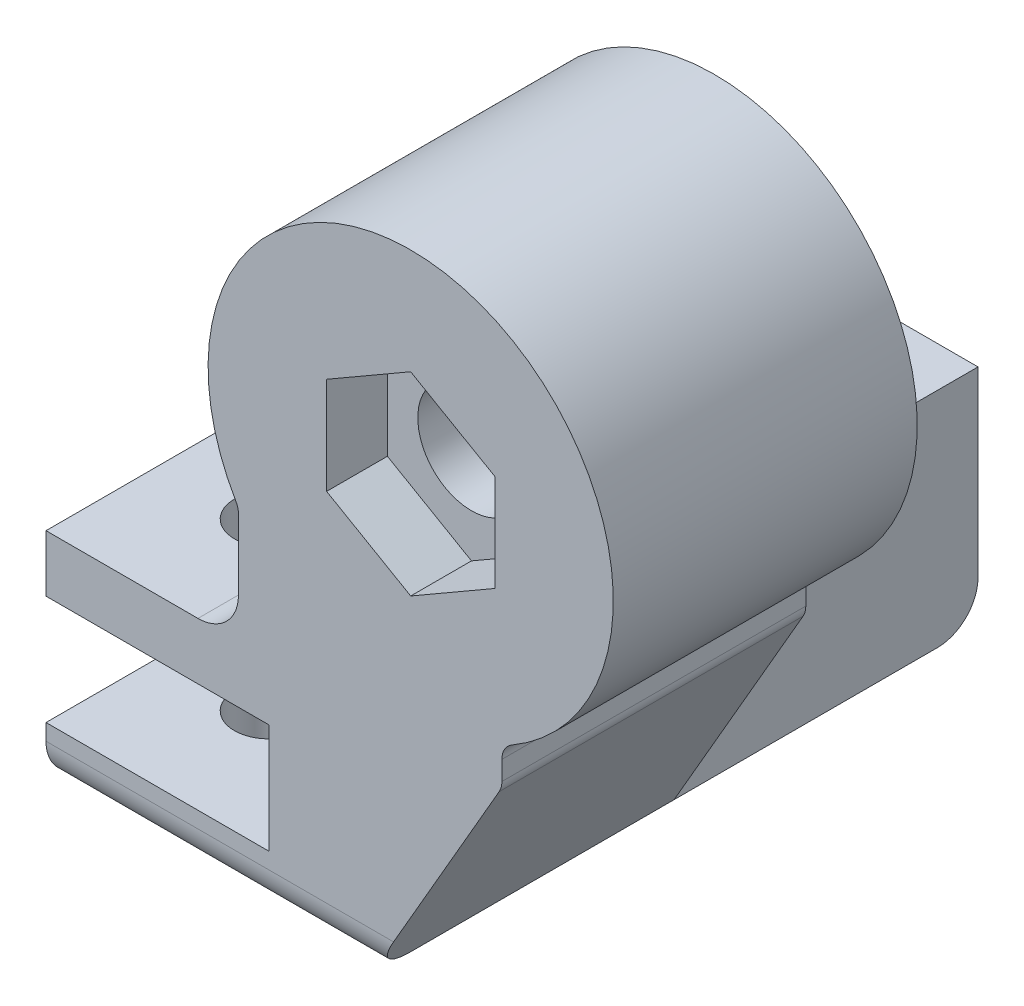
ISO-10303-21;
HEADER;
FILE_DESCRIPTION(('STEP AP214'),'2;1');
FILE_NAME('part.step','',(''),(''),'','','');
FILE_SCHEMA(('AUTOMOTIVE_DESIGN { 1 0 10303 214 1 1 1 1 }'));
ENDSEC;
DATA;
#1=APPLICATION_CONTEXT('core data for automotive mechanical design processes');
#2=APPLICATION_PROTOCOL_DEFINITION('international standard','automotive_design',2000,#1);
#3=PRODUCT_CONTEXT('',#1,'mechanical');
#4=PRODUCT('Part','Part','',(#3));
#5=PRODUCT_RELATED_PRODUCT_CATEGORY('part','',(#4));
#6=PRODUCT_DEFINITION_FORMATION('','',#4);
#7=PRODUCT_DEFINITION_CONTEXT('part definition',#1,'design');
#8=PRODUCT_DEFINITION('design','',#6,#7);
#9=PRODUCT_DEFINITION_SHAPE('','',#8);
#10=(LENGTH_UNIT() NAMED_UNIT(*) SI_UNIT(.MILLI.,.METRE.));
#11=(NAMED_UNIT(*) PLANE_ANGLE_UNIT() SI_UNIT($,.RADIAN.));
#12=(NAMED_UNIT(*) SI_UNIT($,.STERADIAN.) SOLID_ANGLE_UNIT());
#13=UNCERTAINTY_MEASURE_WITH_UNIT(LENGTH_MEASURE(1.E-05),#10,'distance_accuracy_value','');
#14=(GEOMETRIC_REPRESENTATION_CONTEXT(3) GLOBAL_UNCERTAINTY_ASSIGNED_CONTEXT((#13)) GLOBAL_UNIT_ASSIGNED_CONTEXT((#10,
#11,#12)) REPRESENTATION_CONTEXT('',''));
#15=CARTESIAN_POINT('',(0.,0.,0.));
#16=DIRECTION('',(0.,0.,1.));
#17=DIRECTION('',(1.,0.,0.));
#18=AXIS2_PLACEMENT_3D('',#15,#16,#17);
#19=CARTESIAN_POINT('',(18.,22.,-15.));
#20=DIRECTION('',(0.,0.,1.));
#21=DIRECTION('',(1.,0.,0.));
#22=AXIS2_PLACEMENT_3D('',#19,#20,#21);
#23=CYLINDRICAL_SURFACE('',#22,2.65);
#24=CARTESIAN_POINT('',(18.,22.,-10.));
#25=DIRECTION('',(0.,0.,-1.));
#26=DIRECTION('',(-1.,0.,0.));
#27=AXIS2_PLACEMENT_3D('',#24,#25,#26);
#28=CIRCLE('',#27,2.65);
#29=CARTESIAN_POINT('',(15.35,22.,-10.));
#30=VERTEX_POINT('',#29);
#31=EDGE_CURVE('E265',#30,#30,#28,.F.);
#32=ORIENTED_EDGE('',*,*,#31,.F.);
#33=EDGE_LOOP('',(#32));
#34=FACE_BOUND('',#33,.T.);
#35=CARTESIAN_POINT('',(18.,22.,-3.));
#36=DIRECTION('',(0.,0.,1.));
#37=DIRECTION('',(1.,0.,0.));
#38=AXIS2_PLACEMENT_3D('',#35,#36,#37);
#39=CIRCLE('',#38,2.65);
#40=CARTESIAN_POINT('',(20.65,22.,-3.));
#41=VERTEX_POINT('',#40);
#42=EDGE_CURVE('E254',#41,#41,#39,.F.);
#43=ORIENTED_EDGE('',*,*,#42,.F.);
#44=EDGE_LOOP('',(#43));
#45=FACE_BOUND('',#44,.T.);
#46=ADVANCED_FACE('F37',(#34,#45),#23,.F.);
#47=CARTESIAN_POINT('',(16.,11.,-30.));
#48=DIRECTION('',(1.,0.,0.));
#49=DIRECTION('',(0.,1.,0.));
#50=AXIS2_PLACEMENT_3D('',#47,#48,#49);
#51=PLANE('',#50);
#52=DIRECTION('',(0.,0.,1.));
#53=VECTOR('',#52,1.);
#54=CARTESIAN_POINT('',(16.,0.,-30.));
#55=LINE('',#54,#53);
#56=CARTESIAN_POINT('',(16.,0.,-28.));
#57=VERTEX_POINT('',#56);
#58=CARTESIAN_POINT('',(16.,0.,-15.));
#59=VERTEX_POINT('',#58);
#60=EDGE_CURVE('E318',#57,#59,#55,.T.);
#61=ORIENTED_EDGE('',*,*,#60,.F.);
#62=CARTESIAN_POINT('',(16.,2.,-28.));
#63=DIRECTION('',(1.,0.,0.));
#64=DIRECTION('',(0.,1.,0.));
#65=AXIS2_PLACEMENT_3D('',#62,#63,#64);
#66=CIRCLE('',#65,2.);
#67=CARTESIAN_POINT('',(16.,2.00000000000001,-30.));
#68=VERTEX_POINT('',#67);
#69=EDGE_CURVE('E45',#57,#68,#66,.T.);
#70=ORIENTED_EDGE('',*,*,#69,.T.);
#71=DIRECTION('',(0.,1.,0.));
#72=VECTOR('',#71,1.);
#73=CARTESIAN_POINT('',(16.,11.,-30.));
#74=LINE('',#73,#72);
#75=CARTESIAN_POINT('',(16.,11.,-30.));
#76=VERTEX_POINT('',#75);
#77=EDGE_CURVE('E298',#68,#76,#74,.T.);
#78=ORIENTED_EDGE('',*,*,#77,.T.);
#79=DIRECTION('',(0.,0.,1.));
#80=VECTOR('',#79,1.);
#81=CARTESIAN_POINT('',(16.,11.,-30.));
#82=LINE('',#81,#80);
#83=CARTESIAN_POINT('',(16.,11.,-15.));
#84=VERTEX_POINT('',#83);
#85=EDGE_CURVE('E349',#76,#84,#82,.T.);
#86=ORIENTED_EDGE('',*,*,#85,.T.);
#87=DIRECTION('',(0.,-1.,0.));
#88=VECTOR('',#87,1.);
#89=CARTESIAN_POINT('',(16.,0.,-15.));
#90=LINE('',#89,#88);
#91=EDGE_CURVE('E272',#84,#59,#90,.T.);
#92=ORIENTED_EDGE('',*,*,#91,.T.);
#93=EDGE_LOOP('',(#61,#70,#78,#86,#92));
#94=FACE_BOUND('',#93,.T.);
#95=ADVANCED_FACE('F438',(#94),#51,.T.);
#96=CARTESIAN_POINT('',(16.,0.,-30.));
#97=DIRECTION('',(0.,-1.,0.));
#98=DIRECTION('',(1.,0.,0.));
#99=AXIS2_PLACEMENT_3D('',#96,#97,#98);
#100=PLANE('',#99);
#101=CARTESIAN_POINT('',(5.,0.,-6.));
#102=DIRECTION('',(0.,1.,0.));
#103=DIRECTION('',(-1.,0.,0.));
#104=AXIS2_PLACEMENT_3D('',#101,#102,#103);
#105=CIRCLE('',#104,1.7);
#106=CARTESIAN_POINT('',(3.3,0.,-6.));
#107=VERTEX_POINT('',#106);
#108=EDGE_CURVE('E361',#107,#107,#105,.T.);
#109=ORIENTED_EDGE('',*,*,#108,.T.);
#110=EDGE_LOOP('',(#109));
#111=FACE_BOUND('',#110,.T.);
#112=CARTESIAN_POINT('',(5.,0.,-24.));
#113=DIRECTION('',(0.,1.,0.));
#114=DIRECTION('',(-1.,0.,0.));
#115=AXIS2_PLACEMENT_3D('',#112,#113,#114);
#116=CIRCLE('',#115,1.7);
#117=CARTESIAN_POINT('',(3.3,0.,-24.));
#118=VERTEX_POINT('',#117);
#119=EDGE_CURVE('E578',#118,#118,#116,.T.);
#120=ORIENTED_EDGE('',*,*,#119,.T.);
#121=EDGE_LOOP('',(#120));
#122=FACE_BOUND('',#121,.T.);
#123=DIRECTION('',(0.,0.,1.));
#124=VECTOR('',#123,1.);
#125=CARTESIAN_POINT('',(16.,0.,-15.));
#126=LINE('',#125,#124);
#127=CARTESIAN_POINT('',(16.,0.,-2.));
#128=VERTEX_POINT('',#127);
#129=EDGE_CURVE('E286',#59,#128,#126,.T.);
#130=ORIENTED_EDGE('',*,*,#129,.T.);
#131=DIRECTION('',(1.,0.,0.));
#132=VECTOR('',#131,1.);
#133=CARTESIAN_POINT('',(0.,0.,-2.));
#134=LINE('',#133,#132);
#135=CARTESIAN_POINT('',(0.,0.,-2.));
#136=VERTEX_POINT('',#135);
#137=EDGE_CURVE('E413',#128,#136,#134,.F.);
#138=ORIENTED_EDGE('',*,*,#137,.T.);
#139=DIRECTION('',(0.,0.,1.));
#140=VECTOR('',#139,1.);
#141=CARTESIAN_POINT('',(0.,0.,-30.));
#142=LINE('',#141,#140);
#143=CARTESIAN_POINT('',(0.,0.,-28.));
#144=VERTEX_POINT('',#143);
#145=EDGE_CURVE('E334',#144,#136,#142,.T.);
#146=ORIENTED_EDGE('',*,*,#145,.F.);
#147=DIRECTION('',(1.,0.,0.));
#148=VECTOR('',#147,1.);
#149=CARTESIAN_POINT('',(16.,0.,-28.));
#150=LINE('',#149,#148);
#151=EDGE_CURVE('E410',#144,#57,#150,.T.);
#152=ORIENTED_EDGE('',*,*,#151,.T.);
#153=ORIENTED_EDGE('',*,*,#60,.T.);
#154=EDGE_LOOP('',(#130,#138,#146,#152,#153));
#155=FACE_BOUND('',#154,.T.);
#156=ADVANCED_FACE('F436',(#111,#122,#155),#100,.T.);
#157=CARTESIAN_POINT('',(0.,0.,-30.));
#158=DIRECTION('',(-1.,0.,0.));
#159=DIRECTION('',(0.,0.,1.));
#160=AXIS2_PLACEMENT_3D('',#157,#158,#159);
#161=PLANE('',#160);
#162=ORIENTED_EDGE('',*,*,#145,.T.);
#163=CARTESIAN_POINT('',(0.,2.,-2.));
#164=DIRECTION('',(-1.,0.,0.));
#165=DIRECTION('',(0.,0.,1.));
#166=AXIS2_PLACEMENT_3D('',#163,#164,#165);
#167=CIRCLE('',#166,2.);
#168=CARTESIAN_POINT('',(0.,2.,0.));
#169=VERTEX_POINT('',#168);
#170=EDGE_CURVE('E417',#136,#169,#167,.T.);
#171=ORIENTED_EDGE('',*,*,#170,.T.);
#172=DIRECTION('',(0.,-1.,0.));
#173=VECTOR('',#172,1.);
#174=CARTESIAN_POINT('',(0.,0.,0.));
#175=LINE('',#174,#173);
#176=CARTESIAN_POINT('',(0.,2.8,0.));
#177=VERTEX_POINT('',#176);
#178=EDGE_CURVE('E301',#177,#169,#175,.T.);
#179=ORIENTED_EDGE('',*,*,#178,.F.);
#180=DIRECTION('',(0.,0.,1.));
#181=VECTOR('',#180,1.);
#182=CARTESIAN_POINT('',(0.,2.8,-30.));
#183=LINE('',#182,#181);
#184=CARTESIAN_POINT('',(0.,2.8,-30.));
#185=VERTEX_POINT('',#184);
#186=EDGE_CURVE('E338',#185,#177,#183,.T.);
#187=ORIENTED_EDGE('',*,*,#186,.F.);
#188=DIRECTION('',(0.,-1.,0.));
#189=VECTOR('',#188,1.);
#190=CARTESIAN_POINT('',(0.,0.,-30.));
#191=LINE('',#190,#189);
#192=CARTESIAN_POINT('',(0.,2.,-30.));
#193=VERTEX_POINT('',#192);
#194=EDGE_CURVE('E316',#185,#193,#191,.T.);
#195=ORIENTED_EDGE('',*,*,#194,.T.);
#196=CARTESIAN_POINT('',(0.,2.,-28.));
#197=DIRECTION('',(-1.,0.,0.));
#198=DIRECTION('',(0.,0.,1.));
#199=AXIS2_PLACEMENT_3D('',#196,#197,#198);
#200=CIRCLE('',#199,2.);
#201=EDGE_CURVE('E415',#193,#144,#200,.T.);
#202=ORIENTED_EDGE('',*,*,#201,.T.);
#203=EDGE_LOOP('',(#162,#171,#179,#187,#195,#202));
#204=FACE_BOUND('',#203,.T.);
#205=ADVANCED_FACE('F421',(#204),#161,.T.);
#206=CARTESIAN_POINT('',(0.,2.8,-30.));
#207=DIRECTION('',(0.,1.,0.));
#208=DIRECTION('',(-1.,0.,0.));
#209=AXIS2_PLACEMENT_3D('',#206,#207,#208);
#210=PLANE('',#209);
#211=CARTESIAN_POINT('',(5.,2.8,-6.));
#212=DIRECTION('',(0.,1.,0.));
#213=DIRECTION('',(-1.,0.,0.));
#214=AXIS2_PLACEMENT_3D('',#211,#212,#213);
#215=CIRCLE('',#214,1.7);
#216=CARTESIAN_POINT('',(3.3,2.8,-6.));
#217=VERTEX_POINT('',#216);
#218=EDGE_CURVE('E231',#217,#217,#215,.T.);
#219=ORIENTED_EDGE('',*,*,#218,.F.);
#220=EDGE_LOOP('',(#219));
#221=FACE_BOUND('',#220,.T.);
#222=CARTESIAN_POINT('',(5.,2.8,-24.));
#223=DIRECTION('',(0.,1.,0.));
#224=DIRECTION('',(-1.,0.,0.));
#225=AXIS2_PLACEMENT_3D('',#222,#223,#224);
#226=CIRCLE('',#225,1.7);
#227=CARTESIAN_POINT('',(3.3,2.8,-24.));
#228=VERTEX_POINT('',#227);
#229=EDGE_CURVE('E366',#228,#228,#226,.T.);
#230=ORIENTED_EDGE('',*,*,#229,.F.);
#231=EDGE_LOOP('',(#230));
#232=FACE_BOUND('',#231,.T.);
#233=DIRECTION('',(-1.,0.,0.));
#234=VECTOR('',#233,1.);
#235=CARTESIAN_POINT('',(0.,2.8,0.));
#236=LINE('',#235,#234);
#237=CARTESIAN_POINT('',(11.,2.8,0.));
#238=VERTEX_POINT('',#237);
#239=EDGE_CURVE('E329',#238,#177,#236,.T.);
#240=ORIENTED_EDGE('',*,*,#239,.F.);
#241=DIRECTION('',(0.,0.,1.));
#242=VECTOR('',#241,1.);
#243=CARTESIAN_POINT('',(11.,2.8,-30.));
#244=LINE('',#243,#242);
#245=CARTESIAN_POINT('',(11.,2.8,-30.));
#246=VERTEX_POINT('',#245);
#247=EDGE_CURVE('E340',#246,#238,#244,.T.);
#248=ORIENTED_EDGE('',*,*,#247,.F.);
#249=DIRECTION('',(-1.,0.,0.));
#250=VECTOR('',#249,1.);
#251=CARTESIAN_POINT('',(0.,2.8,-30.));
#252=LINE('',#251,#250);
#253=EDGE_CURVE('E313',#246,#185,#252,.T.);
#254=ORIENTED_EDGE('',*,*,#253,.T.);
#255=ORIENTED_EDGE('',*,*,#186,.T.);
#256=EDGE_LOOP('',(#240,#248,#254,#255));
#257=FACE_BOUND('',#256,.T.);
#258=ADVANCED_FACE('F521',(#221,#232,#257),#210,.T.);
#259=CARTESIAN_POINT('',(11.,2.8,-30.));
#260=DIRECTION('',(-1.,0.,0.));
#261=DIRECTION('',(0.,0.,1.));
#262=AXIS2_PLACEMENT_3D('',#259,#260,#261);
#263=PLANE('',#262);
#264=DIRECTION('',(0.,-1.,0.));
#265=VECTOR('',#264,1.);
#266=CARTESIAN_POINT('',(11.,2.8,0.));
#267=LINE('',#266,#265);
#268=CARTESIAN_POINT('',(11.,8.2,0.));
#269=VERTEX_POINT('',#268);
#270=EDGE_CURVE('E326',#269,#238,#267,.T.);
#271=ORIENTED_EDGE('',*,*,#270,.F.);
#272=DIRECTION('',(0.,0.,1.));
#273=VECTOR('',#272,1.);
#274=CARTESIAN_POINT('',(11.,8.2,-30.));
#275=LINE('',#274,#273);
#276=CARTESIAN_POINT('',(11.,8.2,-30.));
#277=VERTEX_POINT('',#276);
#278=EDGE_CURVE('E342',#277,#269,#275,.T.);
#279=ORIENTED_EDGE('',*,*,#278,.F.);
#280=DIRECTION('',(0.,-1.,0.));
#281=VECTOR('',#280,1.);
#282=CARTESIAN_POINT('',(11.,2.8,-30.));
#283=LINE('',#282,#281);
#284=EDGE_CURVE('E310',#277,#246,#283,.T.);
#285=ORIENTED_EDGE('',*,*,#284,.T.);
#286=ORIENTED_EDGE('',*,*,#247,.T.);
#287=EDGE_LOOP('',(#271,#279,#285,#286));
#288=FACE_BOUND('',#287,.T.);
#289=ADVANCED_FACE('F524',(#288),#263,.T.);
#290=CARTESIAN_POINT('',(11.,8.2,-30.));
#291=DIRECTION('',(0.,-1.,0.));
#292=DIRECTION('',(0.,0.,-1.));
#293=AXIS2_PLACEMENT_3D('',#290,#291,#292);
#294=PLANE('',#293);
#295=CARTESIAN_POINT('',(5.,8.2,-6.));
#296=DIRECTION('',(0.,-1.,0.));
#297=DIRECTION('',(0.,0.,-1.));
#298=AXIS2_PLACEMENT_3D('',#295,#296,#297);
#299=CIRCLE('',#298,1.7);
#300=CARTESIAN_POINT('',(5.,8.2,-7.7));
#301=VERTEX_POINT('',#300);
#302=EDGE_CURVE('E365',#301,#301,#299,.T.);
#303=ORIENTED_EDGE('',*,*,#302,.F.);
#304=EDGE_LOOP('',(#303));
#305=FACE_BOUND('',#304,.T.);
#306=CARTESIAN_POINT('',(5.,8.2,-24.));
#307=DIRECTION('',(0.,-1.,0.));
#308=DIRECTION('',(0.,0.,-1.));
#309=AXIS2_PLACEMENT_3D('',#306,#307,#308);
#310=CIRCLE('',#309,1.7);
#311=CARTESIAN_POINT('',(5.,8.2,-25.7));
#312=VERTEX_POINT('',#311);
#313=EDGE_CURVE('E360',#312,#312,#310,.T.);
#314=ORIENTED_EDGE('',*,*,#313,.F.);
#315=EDGE_LOOP('',(#314));
#316=FACE_BOUND('',#315,.T.);
#317=DIRECTION('',(1.,0.,0.));
#318=VECTOR('',#317,1.);
#319=CARTESIAN_POINT('',(11.,8.2,0.));
#320=LINE('',#319,#318);
#321=CARTESIAN_POINT('',(0.,8.2,0.));
#322=VERTEX_POINT('',#321);
#323=EDGE_CURVE('E323',#322,#269,#320,.T.);
#324=ORIENTED_EDGE('',*,*,#323,.F.);
#325=DIRECTION('',(0.,0.,1.));
#326=VECTOR('',#325,1.);
#327=CARTESIAN_POINT('',(0.,8.2,-30.));
#328=LINE('',#327,#326);
#329=CARTESIAN_POINT('',(0.,8.2,-30.));
#330=VERTEX_POINT('',#329);
#331=EDGE_CURVE('E344',#330,#322,#328,.T.);
#332=ORIENTED_EDGE('',*,*,#331,.F.);
#333=DIRECTION('',(1.,0.,0.));
#334=VECTOR('',#333,1.);
#335=CARTESIAN_POINT('',(11.,8.2,-30.));
#336=LINE('',#335,#334);
#337=EDGE_CURVE('E307',#330,#277,#336,.T.);
#338=ORIENTED_EDGE('',*,*,#337,.T.);
#339=ORIENTED_EDGE('',*,*,#278,.T.);
#340=EDGE_LOOP('',(#324,#332,#338,#339));
#341=FACE_BOUND('',#340,.T.);
#342=ADVANCED_FACE('F528',(#305,#316,#341),#294,.T.);
#343=CARTESIAN_POINT('',(0.,8.2,-30.));
#344=DIRECTION('',(-1.,0.,0.));
#345=DIRECTION('',(0.,0.,1.));
#346=AXIS2_PLACEMENT_3D('',#343,#344,#345);
#347=PLANE('',#346);
#348=DIRECTION('',(0.,-1.,0.));
#349=VECTOR('',#348,1.);
#350=CARTESIAN_POINT('',(0.,8.2,0.));
#351=LINE('',#350,#349);
#352=CARTESIAN_POINT('',(0.,11.,0.));
#353=VERTEX_POINT('',#352);
#354=EDGE_CURVE('E320',#353,#322,#351,.T.);
#355=ORIENTED_EDGE('',*,*,#354,.F.);
#356=DIRECTION('',(0.,0.,1.));
#357=VECTOR('',#356,1.);
#358=CARTESIAN_POINT('',(0.,11.,-30.));
#359=LINE('',#358,#357);
#360=CARTESIAN_POINT('',(0.,11.,-30.));
#361=VERTEX_POINT('',#360);
#362=EDGE_CURVE('E346',#361,#353,#359,.T.);
#363=ORIENTED_EDGE('',*,*,#362,.F.);
#364=DIRECTION('',(0.,-1.,0.));
#365=VECTOR('',#364,1.);
#366=CARTESIAN_POINT('',(0.,8.2,-30.));
#367=LINE('',#366,#365);
#368=EDGE_CURVE('E304',#361,#330,#367,.T.);
#369=ORIENTED_EDGE('',*,*,#368,.T.);
#370=ORIENTED_EDGE('',*,*,#331,.T.);
#371=EDGE_LOOP('',(#355,#363,#369,#370));
#372=FACE_BOUND('',#371,.T.);
#373=ADVANCED_FACE('F532',(#372),#347,.T.);
#374=CARTESIAN_POINT('',(0.,11.,-30.));
#375=DIRECTION('',(0.,1.,0.));
#376=DIRECTION('',(-1.,0.,0.));
#377=AXIS2_PLACEMENT_3D('',#374,#375,#376);
#378=PLANE('',#377);
#379=CARTESIAN_POINT('',(5.,11.,-6.));
#380=DIRECTION('',(0.,1.,0.));
#381=DIRECTION('',(-1.,0.,0.));
#382=AXIS2_PLACEMENT_3D('',#379,#380,#381);
#383=CIRCLE('',#382,1.7);
#384=CARTESIAN_POINT('',(3.3,11.,-6.));
#385=VERTEX_POINT('',#384);
#386=EDGE_CURVE('E362',#385,#385,#383,.T.);
#387=ORIENTED_EDGE('',*,*,#386,.F.);
#388=EDGE_LOOP('',(#387));
#389=FACE_BOUND('',#388,.T.);
#390=CARTESIAN_POINT('',(5.,11.,-24.));
#391=DIRECTION('',(0.,1.,0.));
#392=DIRECTION('',(-1.,0.,0.));
#393=AXIS2_PLACEMENT_3D('',#390,#391,#392);
#394=CIRCLE('',#393,1.7);
#395=CARTESIAN_POINT('',(3.3,11.,-24.));
#396=VERTEX_POINT('',#395);
#397=EDGE_CURVE('E357',#396,#396,#394,.T.);
#398=ORIENTED_EDGE('',*,*,#397,.F.);
#399=EDGE_LOOP('',(#398));
#400=FACE_BOUND('',#399,.T.);
#401=DIRECTION('',(-1.,0.,0.));
#402=VECTOR('',#401,1.);
#403=CARTESIAN_POINT('',(0.,11.,0.));
#404=LINE('',#403,#402);
#405=CARTESIAN_POINT('',(7.5,11.,0.));
#406=VERTEX_POINT('',#405);
#407=EDGE_CURVE('E297',#406,#353,#404,.T.);
#408=ORIENTED_EDGE('',*,*,#407,.F.);
#409=DIRECTION('',(0.,0.,1.));
#410=VECTOR('',#409,1.);
#411=CARTESIAN_POINT('',(7.5,11.,-15.));
#412=LINE('',#411,#410);
#413=CARTESIAN_POINT('',(7.5,11.,-15.));
#414=VERTEX_POINT('',#413);
#415=EDGE_CURVE('E369',#406,#414,#412,.F.);
#416=ORIENTED_EDGE('',*,*,#415,.T.);
#417=DIRECTION('',(1.,0.,0.));
#418=VECTOR('',#417,1.);
#419=CARTESIAN_POINT('',(16.,11.,-15.));
#420=LINE('',#419,#418);
#421=EDGE_CURVE('E269',#414,#84,#420,.T.);
#422=ORIENTED_EDGE('',*,*,#421,.T.);
#423=ORIENTED_EDGE('',*,*,#85,.F.);
#424=DIRECTION('',(-1.,0.,0.));
#425=VECTOR('',#424,1.);
#426=CARTESIAN_POINT('',(0.,11.,-30.));
#427=LINE('',#426,#425);
#428=EDGE_CURVE('E300',#76,#361,#427,.T.);
#429=ORIENTED_EDGE('',*,*,#428,.T.);
#430=ORIENTED_EDGE('',*,*,#362,.T.);
#431=EDGE_LOOP('',(#408,#416,#422,#423,#429,#430));
#432=FACE_BOUND('',#431,.T.);
#433=ADVANCED_FACE('F445',(#389,#400,#432),#378,.T.);
#434=CARTESIAN_POINT('',(0.,0.,-30.));
#435=DIRECTION('',(0.,0.,-1.));
#436=DIRECTION('',(-1.,0.,0.));
#437=AXIS2_PLACEMENT_3D('',#434,#435,#436);
#438=PLANE('',#437);
#439=ORIENTED_EDGE('',*,*,#77,.F.);
#440=DIRECTION('',(1.,0.,0.));
#441=VECTOR('',#440,1.);
#442=CARTESIAN_POINT('',(0.,2.,-30.));
#443=LINE('',#442,#441);
#444=EDGE_CURVE('E11',#68,#193,#443,.F.);
#445=ORIENTED_EDGE('',*,*,#444,.T.);
#446=ORIENTED_EDGE('',*,*,#194,.F.);
#447=ORIENTED_EDGE('',*,*,#253,.F.);
#448=ORIENTED_EDGE('',*,*,#284,.F.);
#449=ORIENTED_EDGE('',*,*,#337,.F.);
#450=ORIENTED_EDGE('',*,*,#368,.F.);
#451=ORIENTED_EDGE('',*,*,#428,.F.);
#452=EDGE_LOOP('',(#439,#445,#446,#447,#448,#449,#450,#451));
#453=FACE_BOUND('',#452,.T.);
#454=ADVANCED_FACE('F513',(#453),#438,.T.);
#455=CARTESIAN_POINT('',(0.,0.,0.));
#456=DIRECTION('',(0.,0.,-1.));
#457=DIRECTION('',(-1.,0.,0.));
#458=AXIS2_PLACEMENT_3D('',#455,#456,#457);
#459=PLANE('',#458);
#460=DIRECTION('',(-0.866025403784438,-0.5,0.));
#461=VECTOR('',#460,1.);
#462=CARTESIAN_POINT('',(18.,26.7920072342739,0.));
#463=LINE('',#462,#461);
#464=CARTESIAN_POINT('',(18.,26.7920072342739,0.));
#465=VERTEX_POINT('',#464);
#466=CARTESIAN_POINT('',(13.85,24.396003617137,0.));
#467=VERTEX_POINT('',#466);
#468=EDGE_CURVE('E242',#465,#467,#463,.T.);
#469=ORIENTED_EDGE('',*,*,#468,.F.);
#470=DIRECTION('',(-0.866025403784439,0.5,0.));
#471=VECTOR('',#470,1.);
#472=CARTESIAN_POINT('',(22.15,24.396003617137,0.));
#473=LINE('',#472,#471);
#474=CARTESIAN_POINT('',(22.15,24.396003617137,0.));
#475=VERTEX_POINT('',#474);
#476=EDGE_CURVE('E206',#475,#465,#473,.T.);
#477=ORIENTED_EDGE('',*,*,#476,.F.);
#478=DIRECTION('',(0.,1.,0.));
#479=VECTOR('',#478,1.);
#480=CARTESIAN_POINT('',(22.15,19.6039963828631,0.));
#481=LINE('',#480,#479);
#482=CARTESIAN_POINT('',(22.15,19.6039963828631,0.));
#483=VERTEX_POINT('',#482);
#484=EDGE_CURVE('E225',#483,#475,#481,.T.);
#485=ORIENTED_EDGE('',*,*,#484,.F.);
#486=DIRECTION('',(0.866025403784438,0.5,0.));
#487=VECTOR('',#486,1.);
#488=CARTESIAN_POINT('',(18.,17.2079927657261,0.));
#489=LINE('',#488,#487);
#490=CARTESIAN_POINT('',(18.,17.2079927657261,0.));
#491=VERTEX_POINT('',#490);
#492=EDGE_CURVE('E228',#491,#483,#489,.T.);
#493=ORIENTED_EDGE('',*,*,#492,.F.);
#494=DIRECTION('',(0.866025403784439,-0.5,0.));
#495=VECTOR('',#494,1.);
#496=CARTESIAN_POINT('',(13.85,19.6039963828631,0.));
#497=LINE('',#496,#495);
#498=CARTESIAN_POINT('',(13.85,19.6039963828631,0.));
#499=VERTEX_POINT('',#498);
#500=EDGE_CURVE('E247',#499,#491,#497,.T.);
#501=ORIENTED_EDGE('',*,*,#500,.F.);
#502=DIRECTION('',(0.,-1.,0.));
#503=VECTOR('',#502,1.);
#504=CARTESIAN_POINT('',(13.85,24.396003617137,0.));
#505=LINE('',#504,#503);
#506=EDGE_CURVE('E244',#467,#499,#505,.T.);
#507=ORIENTED_EDGE('',*,*,#506,.F.);
#508=EDGE_LOOP('',(#469,#477,#485,#493,#501,#507));
#509=FACE_BOUND('',#508,.T.);
#510=ORIENTED_EDGE('',*,*,#178,.T.);
#511=DIRECTION('',(1.,0.,0.));
#512=VECTOR('',#511,1.);
#513=CARTESIAN_POINT('',(16.,2.,0.));
#514=LINE('',#513,#512);
#515=CARTESIAN_POINT('',(17.1547005383793,2.,0.));
#516=VERTEX_POINT('',#515);
#517=EDGE_CURVE('E405',#169,#516,#514,.T.);
#518=ORIENTED_EDGE('',*,*,#517,.T.);
#519=DIRECTION('',(0.500000000000004,0.866025403784436,0.));
#520=VECTOR('',#519,1.);
#521=CARTESIAN_POINT('',(22.5,11.2583302491976,0.));
#522=LINE('',#521,#520);
#523=CARTESIAN_POINT('',(22.3660254037844,11.0262794416287,0.));
#524=VERTEX_POINT('',#523);
#525=EDGE_CURVE('E287',#516,#524,#522,.T.);
#526=ORIENTED_EDGE('',*,*,#525,.T.);
#527=CARTESIAN_POINT('',(21.5,11.5262794416287,0.));
#528=DIRECTION('',(0.,0.,-1.));
#529=DIRECTION('',(-1.,0.,0.));
#530=AXIS2_PLACEMENT_3D('',#527,#528,#529);
#531=CIRCLE('',#530,1.);
#532=CARTESIAN_POINT('',(22.5,11.5262794416287,0.));
#533=VERTEX_POINT('',#532);
#534=EDGE_CURVE('E390',#524,#533,#531,.F.);
#535=ORIENTED_EDGE('',*,*,#534,.T.);
#536=DIRECTION('',(0.,1.,0.));
#537=VECTOR('',#536,1.);
#538=CARTESIAN_POINT('',(22.5,11.2583302491976,0.));
#539=LINE('',#538,#537);
#540=CARTESIAN_POINT('',(22.5,12.4737205583712,0.));
#541=VERTEX_POINT('',#540);
#542=EDGE_CURVE('E289',#533,#541,#539,.T.);
#543=ORIENTED_EDGE('',*,*,#542,.T.);
#544=CARTESIAN_POINT('',(23.5,12.4737205583712,0.));
#545=DIRECTION('',(0.,0.,-1.));
#546=DIRECTION('',(-1.,0.,0.));
#547=AXIS2_PLACEMENT_3D('',#544,#545,#546);
#548=CIRCLE('',#547,1.);
#549=CARTESIAN_POINT('',(23.,13.3397459621556,0.));
#550=VERTEX_POINT('',#549);
#551=EDGE_CURVE('E401',#541,#550,#548,.T.);
#552=ORIENTED_EDGE('',*,*,#551,.T.);
#553=CARTESIAN_POINT('',(18.,22.,0.));
#554=DIRECTION('',(0.,0.,1.));
#555=DIRECTION('',(1.,0.,0.));
#556=AXIS2_PLACEMENT_3D('',#553,#554,#555);
#557=CIRCLE('',#556,10.);
#558=CARTESIAN_POINT('',(9.36363636363636,16.9588470425412,0.));
#559=VERTEX_POINT('',#558);
#560=EDGE_CURVE('E292',#550,#559,#557,.T.);
#561=ORIENTED_EDGE('',*,*,#560,.T.);
#562=CARTESIAN_POINT('',(8.5,16.4547317467953,0.));
#563=DIRECTION('',(0.,0.,-1.));
#564=DIRECTION('',(-1.,0.,0.));
#565=AXIS2_PLACEMENT_3D('',#562,#563,#564);
#566=CIRCLE('',#565,1.);
#567=CARTESIAN_POINT('',(9.5,16.4547317467953,0.));
#568=VERTEX_POINT('',#567);
#569=EDGE_CURVE('E382',#559,#568,#566,.T.);
#570=ORIENTED_EDGE('',*,*,#569,.T.);
#571=DIRECTION('',(0.,-1.,0.));
#572=VECTOR('',#571,1.);
#573=CARTESIAN_POINT('',(9.5,11.,0.));
#574=LINE('',#573,#572);
#575=CARTESIAN_POINT('',(9.5,13.,0.));
#576=VERTEX_POINT('',#575);
#577=EDGE_CURVE('E273',#568,#576,#574,.T.);
#578=ORIENTED_EDGE('',*,*,#577,.T.);
#579=CARTESIAN_POINT('',(7.5,13.,0.));
#580=DIRECTION('',(0.,0.,-1.));
#581=DIRECTION('',(-1.,0.,0.));
#582=AXIS2_PLACEMENT_3D('',#579,#580,#581);
#583=CIRCLE('',#582,2.);
#584=EDGE_CURVE('E372',#576,#406,#583,.T.);
#585=ORIENTED_EDGE('',*,*,#584,.T.);
#586=ORIENTED_EDGE('',*,*,#407,.T.);
#587=ORIENTED_EDGE('',*,*,#354,.T.);
#588=ORIENTED_EDGE('',*,*,#323,.T.);
#589=ORIENTED_EDGE('',*,*,#270,.T.);
#590=ORIENTED_EDGE('',*,*,#239,.T.);
#591=EDGE_LOOP('',(#510,#518,#526,#535,#543,#552,#561,#570,#578,#585,#586,#587,#588,#589,#590));
#592=FACE_BOUND('',#591,.T.);
#593=ADVANCED_FACE('F427',(#509,#592),#459,.F.);
#594=CARTESIAN_POINT('',(9.5,11.,-15.));
#595=DIRECTION('',(-1.,0.,0.));
#596=DIRECTION('',(0.,0.,1.));
#597=AXIS2_PLACEMENT_3D('',#594,#595,#596);
#598=PLANE('',#597);
#599=ORIENTED_EDGE('',*,*,#577,.F.);
#600=DIRECTION('',(0.,0.,-1.));
#601=VECTOR('',#600,1.);
#602=CARTESIAN_POINT('',(9.5,16.4547317467953,-15.));
#603=LINE('',#602,#601);
#604=CARTESIAN_POINT('',(9.5,16.4547317467953,-15.));
#605=VERTEX_POINT('',#604);
#606=EDGE_CURVE('E380',#568,#605,#603,.T.);
#607=ORIENTED_EDGE('',*,*,#606,.T.);
#608=DIRECTION('',(0.,-1.,0.));
#609=VECTOR('',#608,1.);
#610=CARTESIAN_POINT('',(9.5,11.,-15.));
#611=LINE('',#610,#609);
#612=CARTESIAN_POINT('',(9.5,13.,-15.));
#613=VERTEX_POINT('',#612);
#614=EDGE_CURVE('E284',#605,#613,#611,.T.);
#615=ORIENTED_EDGE('',*,*,#614,.T.);
#616=DIRECTION('',(0.,0.,1.));
#617=VECTOR('',#616,1.);
#618=CARTESIAN_POINT('',(9.5,13.,0.));
#619=LINE('',#618,#617);
#620=EDGE_CURVE('E337',#613,#576,#619,.T.);
#621=ORIENTED_EDGE('',*,*,#620,.T.);
#622=EDGE_LOOP('',(#599,#607,#615,#621));
#623=FACE_BOUND('',#622,.T.);
#624=ADVANCED_FACE('F504',(#623),#598,.T.);
#625=CARTESIAN_POINT('',(18.,22.,-15.));
#626=DIRECTION('',(0.,0.,1.));
#627=DIRECTION('',(1.,0.,0.));
#628=AXIS2_PLACEMENT_3D('',#625,#626,#627);
#629=CYLINDRICAL_SURFACE('',#628,10.);
#630=ORIENTED_EDGE('',*,*,#560,.F.);
#631=DIRECTION('',(0.,0.,1.));
#632=VECTOR('',#631,1.);
#633=CARTESIAN_POINT('',(23.,13.3397459621556,-15.));
#634=LINE('',#633,#632);
#635=CARTESIAN_POINT('',(23.,13.3397459621556,-15.));
#636=VERTEX_POINT('',#635);
#637=EDGE_CURVE('E399',#550,#636,#634,.F.);
#638=ORIENTED_EDGE('',*,*,#637,.T.);
#639=CARTESIAN_POINT('',(18.,22.,-15.));
#640=DIRECTION('',(0.,0.,1.));
#641=DIRECTION('',(1.,0.,0.));
#642=AXIS2_PLACEMENT_3D('',#639,#640,#641);
#643=CIRCLE('',#642,10.);
#644=CARTESIAN_POINT('',(9.36363636363636,16.9588470425412,-15.));
#645=VERTEX_POINT('',#644);
#646=EDGE_CURVE('E282',#636,#645,#643,.T.);
#647=ORIENTED_EDGE('',*,*,#646,.T.);
#648=DIRECTION('',(0.,0.,1.));
#649=VECTOR('',#648,1.);
#650=CARTESIAN_POINT('',(9.36363636363636,16.9588470425412,-15.));
#651=LINE('',#650,#649);
#652=EDGE_CURVE('E377',#645,#559,#651,.T.);
#653=ORIENTED_EDGE('',*,*,#652,.T.);
#654=EDGE_LOOP('',(#630,#638,#647,#653));
#655=FACE_BOUND('',#654,.T.);
#656=ADVANCED_FACE('F464',(#655),#629,.T.);
#657=CARTESIAN_POINT('',(22.5,11.2583302491976,-15.));
#658=DIRECTION('',(1.,0.,0.));
#659=DIRECTION('',(0.,1.,0.));
#660=AXIS2_PLACEMENT_3D('',#657,#658,#659);
#661=PLANE('',#660);
#662=ORIENTED_EDGE('',*,*,#542,.F.);
#663=DIRECTION('',(0.,0.,1.));
#664=VECTOR('',#663,1.);
#665=CARTESIAN_POINT('',(22.5,11.5262794416287,-15.));
#666=LINE('',#665,#664);
#667=CARTESIAN_POINT('',(22.5,11.5262794416287,-15.));
#668=VERTEX_POINT('',#667);
#669=EDGE_CURVE('E395',#533,#668,#666,.F.);
#670=ORIENTED_EDGE('',*,*,#669,.T.);
#671=DIRECTION('',(0.,1.,0.));
#672=VECTOR('',#671,1.);
#673=CARTESIAN_POINT('',(22.5,11.2583302491976,-15.));
#674=LINE('',#673,#672);
#675=CARTESIAN_POINT('',(22.5,12.4737205583712,-15.));
#676=VERTEX_POINT('',#675);
#677=EDGE_CURVE('E279',#668,#676,#674,.T.);
#678=ORIENTED_EDGE('',*,*,#677,.T.);
#679=DIRECTION('',(0.,0.,-1.));
#680=VECTOR('',#679,1.);
#681=CARTESIAN_POINT('',(22.5,12.4737205583712,0.));
#682=LINE('',#681,#680);
#683=EDGE_CURVE('E392',#676,#541,#682,.F.);
#684=ORIENTED_EDGE('',*,*,#683,.T.);
#685=EDGE_LOOP('',(#662,#670,#678,#684));
#686=FACE_BOUND('',#685,.T.);
#687=ADVANCED_FACE('F472',(#686),#661,.T.);
#688=CARTESIAN_POINT('',(22.5,11.2583302491976,-15.));
#689=DIRECTION('',(0.866025403784436,-0.500000000000004,0.));
#690=DIRECTION('',(0.500000000000004,0.866025403784436,0.));
#691=AXIS2_PLACEMENT_3D('',#688,#689,#690);
#692=PLANE('',#691);
#693=ORIENTED_EDGE('',*,*,#525,.F.);
#694=CARTESIAN_POINT('',(17.1547005383793,2.00000000000001,-2.));
#695=DIRECTION('',(0.866025403784436,-0.500000000000004,0.));
#696=DIRECTION('',(-0.500000000000004,-0.866025403784436,0.));
#697=AXIS2_PLACEMENT_3D('',#694,#695,#696);
#698=ELLIPSE('',#697,2.30940107675851,2.);
#699=EDGE_CURVE('E408',#516,#128,#698,.T.);
#700=ORIENTED_EDGE('',*,*,#699,.T.);
#701=ORIENTED_EDGE('',*,*,#129,.F.);
#702=DIRECTION('',(0.500000000000004,0.866025403784436,0.));
#703=VECTOR('',#702,1.);
#704=CARTESIAN_POINT('',(22.5,11.2583302491976,-15.));
#705=LINE('',#704,#703);
#706=CARTESIAN_POINT('',(22.3660254037844,11.0262794416287,-15.));
#707=VERTEX_POINT('',#706);
#708=EDGE_CURVE('E276',#59,#707,#705,.T.);
#709=ORIENTED_EDGE('',*,*,#708,.T.);
#710=DIRECTION('',(0.,0.,1.));
#711=VECTOR('',#710,1.);
#712=CARTESIAN_POINT('',(22.3660254037844,11.0262794416287,-15.));
#713=LINE('',#712,#711);
#714=EDGE_CURVE('E387',#707,#524,#713,.T.);
#715=ORIENTED_EDGE('',*,*,#714,.T.);
#716=EDGE_LOOP('',(#693,#700,#701,#709,#715));
#717=FACE_BOUND('',#716,.T.);
#718=ADVANCED_FACE('F433',(#717),#692,.T.);
#719=CARTESIAN_POINT('',(18.,22.,-15.));
#720=DIRECTION('',(0.,0.,1.));
#721=DIRECTION('',(1.,0.,0.));
#722=AXIS2_PLACEMENT_3D('',#719,#720,#721);
#723=PLANE('',#722);
#724=CARTESIAN_POINT('',(18.,22.,-15.));
#725=DIRECTION('',(0.,0.,-1.));
#726=DIRECTION('',(-1.,0.,0.));
#727=AXIS2_PLACEMENT_3D('',#724,#725,#726);
#728=CIRCLE('',#727,5.);
#729=CARTESIAN_POINT('',(13.,22.,-15.));
#730=VERTEX_POINT('',#729);
#731=EDGE_CURVE('E266',#730,#730,#728,.T.);
#732=ORIENTED_EDGE('',*,*,#731,.F.);
#733=EDGE_LOOP('',(#732));
#734=FACE_BOUND('',#733,.T.);
#735=ORIENTED_EDGE('',*,*,#677,.F.);
#736=CARTESIAN_POINT('',(21.5,11.5262794416287,-15.));
#737=DIRECTION('',(0.,0.,1.));
#738=DIRECTION('',(1.,0.,0.));
#739=AXIS2_PLACEMENT_3D('',#736,#737,#738);
#740=CIRCLE('',#739,1.);
#741=EDGE_CURVE('E397',#668,#707,#740,.F.);
#742=ORIENTED_EDGE('',*,*,#741,.T.);
#743=ORIENTED_EDGE('',*,*,#708,.F.);
#744=ORIENTED_EDGE('',*,*,#91,.F.);
#745=ORIENTED_EDGE('',*,*,#421,.F.);
#746=CARTESIAN_POINT('',(7.5,13.,-15.));
#747=DIRECTION('',(0.,0.,1.));
#748=DIRECTION('',(1.,0.,0.));
#749=AXIS2_PLACEMENT_3D('',#746,#747,#748);
#750=CIRCLE('',#749,2.);
#751=EDGE_CURVE('E374',#414,#613,#750,.T.);
#752=ORIENTED_EDGE('',*,*,#751,.T.);
#753=ORIENTED_EDGE('',*,*,#614,.F.);
#754=CARTESIAN_POINT('',(8.5,16.4547317467953,-15.));
#755=DIRECTION('',(0.,0.,1.));
#756=DIRECTION('',(1.,0.,0.));
#757=AXIS2_PLACEMENT_3D('',#754,#755,#756);
#758=CIRCLE('',#757,1.);
#759=EDGE_CURVE('E384',#605,#645,#758,.T.);
#760=ORIENTED_EDGE('',*,*,#759,.T.);
#761=ORIENTED_EDGE('',*,*,#646,.F.);
#762=CARTESIAN_POINT('',(23.5,12.4737205583712,-15.));
#763=DIRECTION('',(0.,0.,1.));
#764=DIRECTION('',(1.,0.,0.));
#765=AXIS2_PLACEMENT_3D('',#762,#763,#764);
#766=CIRCLE('',#765,1.);
#767=EDGE_CURVE('E403',#636,#676,#766,.T.);
#768=ORIENTED_EDGE('',*,*,#767,.T.);
#769=EDGE_LOOP('',(#735,#742,#743,#744,#745,#752,#753,#760,#761,#768));
#770=FACE_BOUND('',#769,.T.);
#771=ADVANCED_FACE('F442',(#734,#770),#723,.F.);
#772=CARTESIAN_POINT('',(18.,22.,-10.));
#773=DIRECTION('',(0.,0.,-1.));
#774=DIRECTION('',(-1.,0.,0.));
#775=AXIS2_PLACEMENT_3D('',#772,#773,#774);
#776=PLANE('',#775);
#777=CARTESIAN_POINT('',(18.,22.,-10.));
#778=DIRECTION('',(0.,0.,-1.));
#779=DIRECTION('',(-1.,0.,0.));
#780=AXIS2_PLACEMENT_3D('',#777,#778,#779);
#781=CIRCLE('',#780,5.);
#782=CARTESIAN_POINT('',(13.,22.,-10.));
#783=VERTEX_POINT('',#782);
#784=EDGE_CURVE('E262',#783,#783,#781,.T.);
#785=ORIENTED_EDGE('',*,*,#784,.T.);
#786=EDGE_LOOP('',(#785));
#787=FACE_BOUND('',#786,.T.);
#788=ORIENTED_EDGE('',*,*,#31,.T.);
#789=EDGE_LOOP('',(#788));
#790=FACE_BOUND('',#789,.T.);
#791=ADVANCED_FACE('F502',(#787,#790),#776,.T.);
#792=CARTESIAN_POINT('',(18.,22.,-10.));
#793=DIRECTION('',(0.,0.,-1.));
#794=DIRECTION('',(-1.,0.,0.));
#795=AXIS2_PLACEMENT_3D('',#792,#793,#794);
#796=CYLINDRICAL_SURFACE('',#795,5.);
#797=ORIENTED_EDGE('',*,*,#784,.F.);
#798=EDGE_LOOP('',(#797));
#799=FACE_BOUND('',#798,.T.);
#800=ORIENTED_EDGE('',*,*,#731,.T.);
#801=EDGE_LOOP('',(#800));
#802=FACE_BOUND('',#801,.T.);
#803=ADVANCED_FACE('F498',(#799,#802),#796,.F.);
#804=CARTESIAN_POINT('',(0.,0.,-3.));
#805=DIRECTION('',(0.,0.,1.));
#806=DIRECTION('',(1.,0.,0.));
#807=AXIS2_PLACEMENT_3D('',#804,#805,#806);
#808=PLANE('',#807);
#809=DIRECTION('',(-0.866025403784439,0.5,0.));
#810=VECTOR('',#809,1.);
#811=CARTESIAN_POINT('',(22.15,24.396003617137,-3.));
#812=LINE('',#811,#810);
#813=CARTESIAN_POINT('',(22.15,24.396003617137,-3.));
#814=VERTEX_POINT('',#813);
#815=CARTESIAN_POINT('',(18.,26.7920072342739,-3.));
#816=VERTEX_POINT('',#815);
#817=EDGE_CURVE('E203',#814,#816,#812,.T.);
#818=ORIENTED_EDGE('',*,*,#817,.T.);
#819=DIRECTION('',(-0.866025403784438,-0.5,0.));
#820=VECTOR('',#819,1.);
#821=CARTESIAN_POINT('',(18.,26.7920072342739,-3.));
#822=LINE('',#821,#820);
#823=CARTESIAN_POINT('',(13.85,24.396003617137,-3.));
#824=VERTEX_POINT('',#823);
#825=EDGE_CURVE('E214',#816,#824,#822,.T.);
#826=ORIENTED_EDGE('',*,*,#825,.T.);
#827=DIRECTION('',(0.,-1.,0.));
#828=VECTOR('',#827,1.);
#829=CARTESIAN_POINT('',(13.85,24.396003617137,-3.));
#830=LINE('',#829,#828);
#831=CARTESIAN_POINT('',(13.85,19.6039963828631,-3.));
#832=VERTEX_POINT('',#831);
#833=EDGE_CURVE('E219',#824,#832,#830,.T.);
#834=ORIENTED_EDGE('',*,*,#833,.T.);
#835=DIRECTION('',(0.866025403784439,-0.5,0.));
#836=VECTOR('',#835,1.);
#837=CARTESIAN_POINT('',(13.85,19.6039963828631,-3.));
#838=LINE('',#837,#836);
#839=CARTESIAN_POINT('',(18.,17.2079927657261,-3.));
#840=VERTEX_POINT('',#839);
#841=EDGE_CURVE('E235',#832,#840,#838,.T.);
#842=ORIENTED_EDGE('',*,*,#841,.T.);
#843=DIRECTION('',(0.866025403784438,0.5,0.));
#844=VECTOR('',#843,1.);
#845=CARTESIAN_POINT('',(18.,17.2079927657261,-3.));
#846=LINE('',#845,#844);
#847=CARTESIAN_POINT('',(22.15,19.6039963828631,-3.));
#848=VERTEX_POINT('',#847);
#849=EDGE_CURVE('E238',#840,#848,#846,.T.);
#850=ORIENTED_EDGE('',*,*,#849,.T.);
#851=DIRECTION('',(0.,1.,0.));
#852=VECTOR('',#851,1.);
#853=CARTESIAN_POINT('',(22.15,19.6039963828631,-3.));
#854=LINE('',#853,#852);
#855=EDGE_CURVE('E211',#848,#814,#854,.T.);
#856=ORIENTED_EDGE('',*,*,#855,.T.);
#857=EDGE_LOOP('',(#818,#826,#834,#842,#850,#856));
#858=FACE_BOUND('',#857,.T.);
#859=ORIENTED_EDGE('',*,*,#42,.T.);
#860=EDGE_LOOP('',(#859));
#861=FACE_BOUND('',#860,.T.);
#862=ADVANCED_FACE('F221',(#858,#861),#808,.T.);
#863=CARTESIAN_POINT('',(22.15,24.396003617137,-3.));
#864=DIRECTION('',(0.5,0.866025403784438,0.));
#865=DIRECTION('',(-0.866025403784439,0.5,0.));
#866=AXIS2_PLACEMENT_3D('',#863,#864,#865);
#867=PLANE('',#866);
#868=ORIENTED_EDGE('',*,*,#476,.T.);
#869=DIRECTION('',(0.,0.,1.));
#870=VECTOR('',#869,1.);
#871=CARTESIAN_POINT('',(18.,26.7920072342739,-3.));
#872=LINE('',#871,#870);
#873=EDGE_CURVE('E199',#816,#465,#872,.T.);
#874=ORIENTED_EDGE('',*,*,#873,.F.);
#875=ORIENTED_EDGE('',*,*,#817,.F.);
#876=DIRECTION('',(0.,0.,1.));
#877=VECTOR('',#876,1.);
#878=CARTESIAN_POINT('',(22.15,24.396003617137,-3.));
#879=LINE('',#878,#877);
#880=EDGE_CURVE('E252',#814,#475,#879,.T.);
#881=ORIENTED_EDGE('',*,*,#880,.T.);
#882=EDGE_LOOP('',(#868,#874,#875,#881));
#883=FACE_BOUND('',#882,.T.);
#884=ADVANCED_FACE('F201',(#883),#867,.F.);
#885=CARTESIAN_POINT('',(22.15,19.6039963828631,-3.));
#886=DIRECTION('',(1.,0.,0.));
#887=DIRECTION('',(0.,0.,-1.));
#888=AXIS2_PLACEMENT_3D('',#885,#886,#887);
#889=PLANE('',#888);
#890=ORIENTED_EDGE('',*,*,#484,.T.);
#891=ORIENTED_EDGE('',*,*,#880,.F.);
#892=ORIENTED_EDGE('',*,*,#855,.F.);
#893=DIRECTION('',(0.,0.,1.));
#894=VECTOR('',#893,1.);
#895=CARTESIAN_POINT('',(22.15,19.6039963828631,-3.));
#896=LINE('',#895,#894);
#897=EDGE_CURVE('E255',#848,#483,#896,.T.);
#898=ORIENTED_EDGE('',*,*,#897,.T.);
#899=EDGE_LOOP('',(#890,#891,#892,#898));
#900=FACE_BOUND('',#899,.T.);
#901=ADVANCED_FACE('F685',(#900),#889,.F.);
#902=CARTESIAN_POINT('',(18.,17.2079927657261,-3.));
#903=DIRECTION('',(0.5,-0.866025403784438,0.));
#904=DIRECTION('',(0.866025403784438,0.5,0.));
#905=AXIS2_PLACEMENT_3D('',#902,#903,#904);
#906=PLANE('',#905);
#907=ORIENTED_EDGE('',*,*,#492,.T.);
#908=ORIENTED_EDGE('',*,*,#897,.F.);
#909=ORIENTED_EDGE('',*,*,#849,.F.);
#910=DIRECTION('',(0.,0.,1.));
#911=VECTOR('',#910,1.);
#912=CARTESIAN_POINT('',(18.,17.2079927657261,-3.));
#913=LINE('',#912,#911);
#914=EDGE_CURVE('E257',#840,#491,#913,.T.);
#915=ORIENTED_EDGE('',*,*,#914,.T.);
#916=EDGE_LOOP('',(#907,#908,#909,#915));
#917=FACE_BOUND('',#916,.T.);
#918=ADVANCED_FACE('F692',(#917),#906,.F.);
#919=CARTESIAN_POINT('',(13.85,19.6039963828631,-3.));
#920=DIRECTION('',(-0.5,-0.866025403784439,0.));
#921=DIRECTION('',(0.866025403784439,-0.5,0.));
#922=AXIS2_PLACEMENT_3D('',#919,#920,#921);
#923=PLANE('',#922);
#924=ORIENTED_EDGE('',*,*,#500,.T.);
#925=ORIENTED_EDGE('',*,*,#914,.F.);
#926=ORIENTED_EDGE('',*,*,#841,.F.);
#927=DIRECTION('',(0.,0.,1.));
#928=VECTOR('',#927,1.);
#929=CARTESIAN_POINT('',(13.85,19.6039963828631,-3.));
#930=LINE('',#929,#928);
#931=EDGE_CURVE('E259',#832,#499,#930,.T.);
#932=ORIENTED_EDGE('',*,*,#931,.T.);
#933=EDGE_LOOP('',(#924,#925,#926,#932));
#934=FACE_BOUND('',#933,.T.);
#935=ADVANCED_FACE('F700',(#934),#923,.F.);
#936=CARTESIAN_POINT('',(13.85,24.396003617137,-3.));
#937=DIRECTION('',(-1.,0.,0.));
#938=DIRECTION('',(0.,0.,1.));
#939=AXIS2_PLACEMENT_3D('',#936,#937,#938);
#940=PLANE('',#939);
#941=ORIENTED_EDGE('',*,*,#506,.T.);
#942=ORIENTED_EDGE('',*,*,#931,.F.);
#943=ORIENTED_EDGE('',*,*,#833,.F.);
#944=DIRECTION('',(0.,0.,1.));
#945=VECTOR('',#944,1.);
#946=CARTESIAN_POINT('',(13.85,24.396003617137,-3.));
#947=LINE('',#946,#945);
#948=EDGE_CURVE('E210',#824,#467,#947,.T.);
#949=ORIENTED_EDGE('',*,*,#948,.T.);
#950=EDGE_LOOP('',(#941,#942,#943,#949));
#951=FACE_BOUND('',#950,.T.);
#952=ADVANCED_FACE('F708',(#951),#940,.F.);
#953=CARTESIAN_POINT('',(18.,26.7920072342739,-3.));
#954=DIRECTION('',(-0.5,0.866025403784439,0.));
#955=DIRECTION('',(-0.866025403784439,-0.5,0.));
#956=AXIS2_PLACEMENT_3D('',#953,#954,#955);
#957=PLANE('',#956);
#958=ORIENTED_EDGE('',*,*,#468,.T.);
#959=ORIENTED_EDGE('',*,*,#948,.F.);
#960=ORIENTED_EDGE('',*,*,#825,.F.);
#961=ORIENTED_EDGE('',*,*,#873,.T.);
#962=EDGE_LOOP('',(#958,#959,#960,#961));
#963=FACE_BOUND('',#962,.T.);
#964=ADVANCED_FACE('F215',(#963),#957,.F.);
#965=CARTESIAN_POINT('',(5.,0.,-24.));
#966=DIRECTION('',(0.,1.,0.));
#967=DIRECTION('',(-1.,0.,0.));
#968=AXIS2_PLACEMENT_3D('',#965,#966,#967);
#969=CYLINDRICAL_SURFACE('',#968,1.7);
#970=ORIENTED_EDGE('',*,*,#313,.T.);
#971=EDGE_LOOP('',(#970));
#972=FACE_BOUND('',#971,.T.);
#973=ORIENTED_EDGE('',*,*,#397,.T.);
#974=EDGE_LOOP('',(#973));
#975=FACE_BOUND('',#974,.T.);
#976=ADVANCED_FACE('F557',(#972,#975),#969,.F.);
#977=CARTESIAN_POINT('',(5.,0.,-6.));
#978=DIRECTION('',(0.,1.,0.));
#979=DIRECTION('',(-1.,0.,0.));
#980=AXIS2_PLACEMENT_3D('',#977,#978,#979);
#981=CYLINDRICAL_SURFACE('',#980,1.7);
#982=ORIENTED_EDGE('',*,*,#302,.T.);
#983=EDGE_LOOP('',(#982));
#984=FACE_BOUND('',#983,.T.);
#985=ORIENTED_EDGE('',*,*,#386,.T.);
#986=EDGE_LOOP('',(#985));
#987=FACE_BOUND('',#986,.T.);
#988=ADVANCED_FACE('F551',(#984,#987),#981,.F.);
#989=ORIENTED_EDGE('',*,*,#229,.T.);
#990=EDGE_LOOP('',(#989));
#991=FACE_BOUND('',#990,.T.);
#992=ORIENTED_EDGE('',*,*,#119,.F.);
#993=EDGE_LOOP('',(#992));
#994=FACE_BOUND('',#993,.T.);
#995=ADVANCED_FACE('F548',(#991,#994),#969,.F.);
#996=ORIENTED_EDGE('',*,*,#218,.T.);
#997=EDGE_LOOP('',(#996));
#998=FACE_BOUND('',#997,.T.);
#999=ORIENTED_EDGE('',*,*,#108,.F.);
#1000=EDGE_LOOP('',(#999));
#1001=FACE_BOUND('',#1000,.T.);
#1002=ADVANCED_FACE('F544',(#998,#1001),#981,.F.);
#1003=CARTESIAN_POINT('',(7.5,13.,-15.));
#1004=DIRECTION('',(0.,0.,-1.));
#1005=DIRECTION('',(-1.,0.,0.));
#1006=AXIS2_PLACEMENT_3D('',#1003,#1004,#1005);
#1007=CYLINDRICAL_SURFACE('',#1006,2.);
#1008=ORIENTED_EDGE('',*,*,#751,.F.);
#1009=ORIENTED_EDGE('',*,*,#415,.F.);
#1010=ORIENTED_EDGE('',*,*,#584,.F.);
#1011=ORIENTED_EDGE('',*,*,#620,.F.);
#1012=EDGE_LOOP('',(#1008,#1009,#1010,#1011));
#1013=FACE_BOUND('',#1012,.T.);
#1014=ADVANCED_FACE('F452',(#1013),#1007,.F.);
#1015=CARTESIAN_POINT('',(8.5,16.4547317467953,-15.));
#1016=DIRECTION('',(0.,0.,1.));
#1017=DIRECTION('',(1.,0.,0.));
#1018=AXIS2_PLACEMENT_3D('',#1015,#1016,#1017);
#1019=CYLINDRICAL_SURFACE('',#1018,1.);
#1020=ORIENTED_EDGE('',*,*,#759,.F.);
#1021=ORIENTED_EDGE('',*,*,#606,.F.);
#1022=ORIENTED_EDGE('',*,*,#569,.F.);
#1023=ORIENTED_EDGE('',*,*,#652,.F.);
#1024=EDGE_LOOP('',(#1020,#1021,#1022,#1023));
#1025=FACE_BOUND('',#1024,.T.);
#1026=ADVANCED_FACE('F460',(#1025),#1019,.F.);
#1027=CARTESIAN_POINT('',(21.5,11.5262794416287,-15.));
#1028=DIRECTION('',(0.,0.,1.));
#1029=DIRECTION('',(1.,0.,0.));
#1030=AXIS2_PLACEMENT_3D('',#1027,#1028,#1029);
#1031=CYLINDRICAL_SURFACE('',#1030,1.);
#1032=ORIENTED_EDGE('',*,*,#741,.F.);
#1033=ORIENTED_EDGE('',*,*,#669,.F.);
#1034=ORIENTED_EDGE('',*,*,#534,.F.);
#1035=ORIENTED_EDGE('',*,*,#714,.F.);
#1036=EDGE_LOOP('',(#1032,#1033,#1034,#1035));
#1037=FACE_BOUND('',#1036,.T.);
#1038=ADVANCED_FACE('F478',(#1037),#1031,.T.);
#1039=CARTESIAN_POINT('',(23.5,12.4737205583712,-15.));
#1040=DIRECTION('',(0.,0.,1.));
#1041=DIRECTION('',(1.,0.,0.));
#1042=AXIS2_PLACEMENT_3D('',#1039,#1040,#1041);
#1043=CYLINDRICAL_SURFACE('',#1042,1.);
#1044=ORIENTED_EDGE('',*,*,#767,.F.);
#1045=ORIENTED_EDGE('',*,*,#637,.F.);
#1046=ORIENTED_EDGE('',*,*,#551,.F.);
#1047=ORIENTED_EDGE('',*,*,#683,.F.);
#1048=EDGE_LOOP('',(#1044,#1045,#1046,#1047));
#1049=FACE_BOUND('',#1048,.T.);
#1050=ADVANCED_FACE('F469',(#1049),#1043,.F.);
#1051=CARTESIAN_POINT('',(0.,2.,-2.));
#1052=DIRECTION('',(-1.,0.,0.));
#1053=DIRECTION('',(0.,-1.,0.));
#1054=AXIS2_PLACEMENT_3D('',#1051,#1052,#1053);
#1055=CYLINDRICAL_SURFACE('',#1054,2.);
#1056=ORIENTED_EDGE('',*,*,#170,.F.);
#1057=ORIENTED_EDGE('',*,*,#137,.F.);
#1058=ORIENTED_EDGE('',*,*,#699,.F.);
#1059=ORIENTED_EDGE('',*,*,#517,.F.);
#1060=EDGE_LOOP('',(#1056,#1057,#1058,#1059));
#1061=FACE_BOUND('',#1060,.T.);
#1062=ADVANCED_FACE('F430',(#1061),#1055,.T.);
#1063=CARTESIAN_POINT('',(16.,2.,-28.));
#1064=DIRECTION('',(1.,0.,0.));
#1065=DIRECTION('',(0.,1.,0.));
#1066=AXIS2_PLACEMENT_3D('',#1063,#1064,#1065);
#1067=CYLINDRICAL_SURFACE('',#1066,2.);
#1068=ORIENTED_EDGE('',*,*,#201,.F.);
#1069=ORIENTED_EDGE('',*,*,#444,.F.);
#1070=ORIENTED_EDGE('',*,*,#69,.F.);
#1071=ORIENTED_EDGE('',*,*,#151,.F.);
#1072=EDGE_LOOP('',(#1068,#1069,#1070,#1071));
#1073=FACE_BOUND('',#1072,.T.);
#1074=ADVANCED_FACE('F39',(#1073),#1067,.T.);
#1075=CLOSED_SHELL('',(#46,#95,#156,#205,#258,#289,#342,#373,#433,#454,#593,#624,#656,#687,#718,
#771,#791,#803,#862,#884,#901,#918,#935,#952,#964,#976,#988,#995,#1002,#1014,#1026,#1038,#1050,
#1062,#1074));
#1076=MANIFOLD_SOLID_BREP('B2',#1075);
#1077=ADVANCED_BREP_SHAPE_REPRESENTATION('',(#18,#1076),#14);
#1078=SHAPE_DEFINITION_REPRESENTATION(#9,#1077);
ENDSEC;
END-ISO-10303-21;
